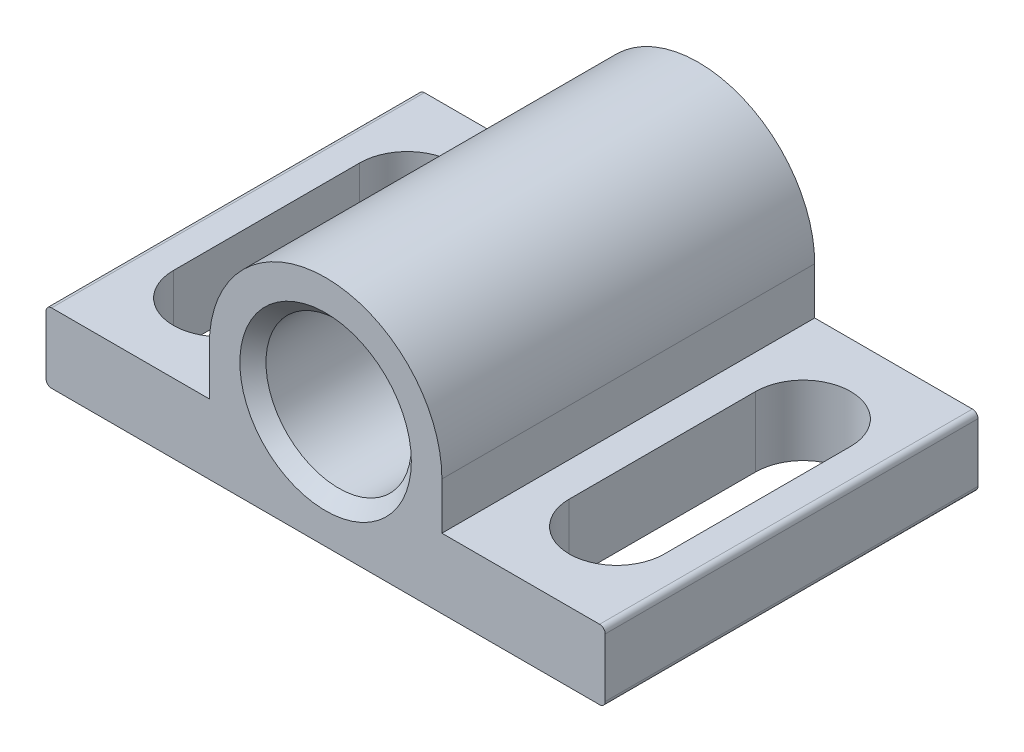
ISO-10303-21;
HEADER;
FILE_DESCRIPTION(('STEP AP214'),'2;1');
FILE_NAME('part.step','',(''),(''),'','','');
FILE_SCHEMA(('AUTOMOTIVE_DESIGN { 1 0 10303 214 1 1 1 1 }'));
ENDSEC;
DATA;
#1=APPLICATION_CONTEXT('core data for automotive mechanical design processes');
#2=APPLICATION_PROTOCOL_DEFINITION('international standard','automotive_design',2000,#1);
#3=PRODUCT_CONTEXT('',#1,'mechanical');
#4=PRODUCT('Part','Part','',(#3));
#5=PRODUCT_RELATED_PRODUCT_CATEGORY('part','',(#4));
#6=PRODUCT_DEFINITION_FORMATION('','',#4);
#7=PRODUCT_DEFINITION_CONTEXT('part definition',#1,'design');
#8=PRODUCT_DEFINITION('design','',#6,#7);
#9=PRODUCT_DEFINITION_SHAPE('','',#8);
#10=(LENGTH_UNIT() NAMED_UNIT(*) SI_UNIT(.MILLI.,.METRE.));
#11=(NAMED_UNIT(*) PLANE_ANGLE_UNIT() SI_UNIT($,.RADIAN.));
#12=(NAMED_UNIT(*) SI_UNIT($,.STERADIAN.) SOLID_ANGLE_UNIT());
#13=UNCERTAINTY_MEASURE_WITH_UNIT(LENGTH_MEASURE(1.E-05),#10,'distance_accuracy_value','');
#14=(GEOMETRIC_REPRESENTATION_CONTEXT(3) GLOBAL_UNCERTAINTY_ASSIGNED_CONTEXT((#13)) GLOBAL_UNIT_ASSIGNED_CONTEXT((#10,
#11,#12)) REPRESENTATION_CONTEXT('',''));
#15=CARTESIAN_POINT('',(0.,0.,0.));
#16=DIRECTION('',(0.,0.,1.));
#17=DIRECTION('',(1.,0.,0.));
#18=AXIS2_PLACEMENT_3D('',#15,#16,#17);
#19=CARTESIAN_POINT('',(0.,5.5753,12.7));
#20=DIRECTION('',(0.,0.,1.));
#21=DIRECTION('',(1.,0.,0.));
#22=AXIS2_PLACEMENT_3D('',#19,#20,#21);
#23=PLANE('',#22);
#24=CARTESIAN_POINT('',(0.,5.5753,12.7));
#25=DIRECTION('',(0.,0.,1.));
#26=DIRECTION('',(1.,0.,0.));
#27=AXIS2_PLACEMENT_3D('',#24,#25,#26);
#28=CIRCLE('',#27,5.84200000000002);
#29=CARTESIAN_POINT('',(5.84200000000002,5.5753,12.7));
#30=VERTEX_POINT('',#29);
#31=EDGE_CURVE('E321',#30,#30,#28,.F.);
#32=ORIENTED_EDGE('',*,*,#31,.T.);
#33=EDGE_LOOP('',(#32));
#34=FACE_BOUND('',#33,.T.);
#35=DIRECTION('',(0.,1.,0.));
#36=VECTOR('',#35,1.);
#37=CARTESIAN_POINT('',(19.05,-2.3749,12.7));
#38=LINE('',#37,#36);
#39=CARTESIAN_POINT('',(19.05,-1.9939,12.7));
#40=VERTEX_POINT('',#39);
#41=CARTESIAN_POINT('',(19.05,1.9939,12.7));
#42=VERTEX_POINT('',#41);
#43=EDGE_CURVE('E247',#40,#42,#38,.T.);
#44=ORIENTED_EDGE('',*,*,#43,.T.);
#45=CARTESIAN_POINT('',(18.669,1.9939,12.7));
#46=DIRECTION('',(0.,0.,1.));
#47=DIRECTION('',(1.,0.,0.));
#48=AXIS2_PLACEMENT_3D('',#45,#46,#47);
#49=CIRCLE('',#48,0.381);
#50=CARTESIAN_POINT('',(18.669,2.3749,12.7));
#51=VERTEX_POINT('',#50);
#52=EDGE_CURVE('E302',#42,#51,#49,.T.);
#53=ORIENTED_EDGE('',*,*,#52,.T.);
#54=DIRECTION('',(-1.,0.,0.));
#55=VECTOR('',#54,1.);
#56=CARTESIAN_POINT('',(7.9248,2.3749,12.7));
#57=LINE('',#56,#55);
#58=CARTESIAN_POINT('',(7.9248,2.3749,12.7));
#59=VERTEX_POINT('',#58);
#60=EDGE_CURVE('E229',#51,#59,#57,.T.);
#61=ORIENTED_EDGE('',*,*,#60,.T.);
#62=DIRECTION('',(0.,1.,0.));
#63=VECTOR('',#62,1.);
#64=CARTESIAN_POINT('',(7.9248,5.5753,12.7));
#65=LINE('',#64,#63);
#66=CARTESIAN_POINT('',(7.9248,5.5753,12.7));
#67=VERTEX_POINT('',#66);
#68=EDGE_CURVE('E231',#59,#67,#65,.T.);
#69=ORIENTED_EDGE('',*,*,#68,.T.);
#70=CARTESIAN_POINT('',(0.,5.5753,12.7));
#71=DIRECTION('',(0.,0.,1.));
#72=DIRECTION('',(1.,0.,0.));
#73=AXIS2_PLACEMENT_3D('',#70,#71,#72);
#74=CIRCLE('',#73,7.9248);
#75=CARTESIAN_POINT('',(-7.9248,5.5753,12.7));
#76=VERTEX_POINT('',#75);
#77=EDGE_CURVE('E234',#67,#76,#74,.T.);
#78=ORIENTED_EDGE('',*,*,#77,.T.);
#79=DIRECTION('',(0.,-1.,0.));
#80=VECTOR('',#79,1.);
#81=CARTESIAN_POINT('',(-7.9248,5.5753,12.7));
#82=LINE('',#81,#80);
#83=CARTESIAN_POINT('',(-7.9248,2.3749,12.7));
#84=VERTEX_POINT('',#83);
#85=EDGE_CURVE('E236',#76,#84,#82,.T.);
#86=ORIENTED_EDGE('',*,*,#85,.T.);
#87=DIRECTION('',(-1.,0.,0.));
#88=VECTOR('',#87,1.);
#89=CARTESIAN_POINT('',(-19.05,2.3749,12.7));
#90=LINE('',#89,#88);
#91=CARTESIAN_POINT('',(-18.669,2.3749,12.7));
#92=VERTEX_POINT('',#91);
#93=EDGE_CURVE('E238',#84,#92,#90,.T.);
#94=ORIENTED_EDGE('',*,*,#93,.T.);
#95=CARTESIAN_POINT('',(-18.669,1.9939,12.7));
#96=DIRECTION('',(0.,0.,1.));
#97=DIRECTION('',(1.,0.,0.));
#98=AXIS2_PLACEMENT_3D('',#95,#96,#97);
#99=CIRCLE('',#98,0.381);
#100=CARTESIAN_POINT('',(-19.05,1.9939,12.7));
#101=VERTEX_POINT('',#100);
#102=EDGE_CURVE('E298',#92,#101,#99,.T.);
#103=ORIENTED_EDGE('',*,*,#102,.T.);
#104=DIRECTION('',(0.,-1.,0.));
#105=VECTOR('',#104,1.);
#106=CARTESIAN_POINT('',(-19.05,-2.3749,12.7));
#107=LINE('',#106,#105);
#108=CARTESIAN_POINT('',(-19.05,-1.9939,12.7));
#109=VERTEX_POINT('',#108);
#110=EDGE_CURVE('E241',#101,#109,#107,.T.);
#111=ORIENTED_EDGE('',*,*,#110,.T.);
#112=CARTESIAN_POINT('',(-18.669,-1.9939,12.7));
#113=DIRECTION('',(0.,0.,1.));
#114=DIRECTION('',(1.,0.,0.));
#115=AXIS2_PLACEMENT_3D('',#112,#113,#114);
#116=CIRCLE('',#115,0.381);
#117=CARTESIAN_POINT('',(-18.669,-2.3749,12.7));
#118=VERTEX_POINT('',#117);
#119=EDGE_CURVE('E300',#109,#118,#116,.T.);
#120=ORIENTED_EDGE('',*,*,#119,.T.);
#121=DIRECTION('',(1.,0.,0.));
#122=VECTOR('',#121,1.);
#123=CARTESIAN_POINT('',(-19.05,-2.3749,12.7));
#124=LINE('',#123,#122);
#125=CARTESIAN_POINT('',(18.669,-2.3749,12.7));
#126=VERTEX_POINT('',#125);
#127=EDGE_CURVE('E244',#118,#126,#124,.T.);
#128=ORIENTED_EDGE('',*,*,#127,.T.);
#129=CARTESIAN_POINT('',(18.669,-1.9939,12.7));
#130=DIRECTION('',(0.,0.,1.));
#131=DIRECTION('',(1.,0.,0.));
#132=AXIS2_PLACEMENT_3D('',#129,#130,#131);
#133=CIRCLE('',#132,0.381);
#134=EDGE_CURVE('E296',#126,#40,#133,.T.);
#135=ORIENTED_EDGE('',*,*,#134,.T.);
#136=EDGE_LOOP('',(#44,#53,#61,#69,#78,#86,#94,#103,#111,#120,#128,#135));
#137=FACE_BOUND('',#136,.T.);
#138=ADVANCED_FACE('F36',(#34,#137),#23,.T.);
#139=CARTESIAN_POINT('',(0.,5.5753,-12.7));
#140=DIRECTION('',(0.,0.,1.));
#141=DIRECTION('',(1.,0.,0.));
#142=AXIS2_PLACEMENT_3D('',#139,#140,#141);
#143=PLANE('',#142);
#144=DIRECTION('',(-1.,0.,0.));
#145=VECTOR('',#144,1.);
#146=CARTESIAN_POINT('',(7.9248,2.3749,-12.7));
#147=LINE('',#146,#145);
#148=CARTESIAN_POINT('',(18.669,2.3749,-12.7));
#149=VERTEX_POINT('',#148);
#150=CARTESIAN_POINT('',(7.9248,2.3749,-12.7));
#151=VERTEX_POINT('',#150);
#152=EDGE_CURVE('E228',#149,#151,#147,.T.);
#153=ORIENTED_EDGE('',*,*,#152,.F.);
#154=CARTESIAN_POINT('',(18.669,1.9939,-12.7));
#155=DIRECTION('',(0.,0.,1.));
#156=DIRECTION('',(1.,0.,0.));
#157=AXIS2_PLACEMENT_3D('',#154,#155,#156);
#158=CIRCLE('',#157,0.381);
#159=CARTESIAN_POINT('',(19.05,1.9939,-12.7));
#160=VERTEX_POINT('',#159);
#161=EDGE_CURVE('E289',#149,#160,#158,.F.);
#162=ORIENTED_EDGE('',*,*,#161,.T.);
#163=DIRECTION('',(0.,1.,0.));
#164=VECTOR('',#163,1.);
#165=CARTESIAN_POINT('',(19.05,-2.3749,-12.7));
#166=LINE('',#165,#164);
#167=CARTESIAN_POINT('',(19.05,-1.9939,-12.7));
#168=VERTEX_POINT('',#167);
#169=EDGE_CURVE('E232',#168,#160,#166,.T.);
#170=ORIENTED_EDGE('',*,*,#169,.F.);
#171=CARTESIAN_POINT('',(18.669,-1.9939,-12.7));
#172=DIRECTION('',(0.,0.,1.));
#173=DIRECTION('',(1.,0.,0.));
#174=AXIS2_PLACEMENT_3D('',#171,#172,#173);
#175=CIRCLE('',#174,0.381);
#176=CARTESIAN_POINT('',(18.669,-2.3749,-12.7));
#177=VERTEX_POINT('',#176);
#178=EDGE_CURVE('E283',#168,#177,#175,.F.);
#179=ORIENTED_EDGE('',*,*,#178,.T.);
#180=DIRECTION('',(1.,0.,0.));
#181=VECTOR('',#180,1.);
#182=CARTESIAN_POINT('',(-19.05,-2.3749,-12.7));
#183=LINE('',#182,#181);
#184=CARTESIAN_POINT('',(-18.669,-2.3749,-12.7));
#185=VERTEX_POINT('',#184);
#186=EDGE_CURVE('E264',#185,#177,#183,.T.);
#187=ORIENTED_EDGE('',*,*,#186,.F.);
#188=CARTESIAN_POINT('',(-18.669,-1.9939,-12.7));
#189=DIRECTION('',(0.,0.,1.));
#190=DIRECTION('',(1.,0.,0.));
#191=AXIS2_PLACEMENT_3D('',#188,#189,#190);
#192=CIRCLE('',#191,0.381);
#193=CARTESIAN_POINT('',(-19.05,-1.9939,-12.7));
#194=VERTEX_POINT('',#193);
#195=EDGE_CURVE('E287',#185,#194,#192,.F.);
#196=ORIENTED_EDGE('',*,*,#195,.T.);
#197=DIRECTION('',(0.,-1.,0.));
#198=VECTOR('',#197,1.);
#199=CARTESIAN_POINT('',(-19.05,-2.3749,-12.7));
#200=LINE('',#199,#198);
#201=CARTESIAN_POINT('',(-19.05,1.9939,-12.7));
#202=VERTEX_POINT('',#201);
#203=EDGE_CURVE('E261',#202,#194,#200,.T.);
#204=ORIENTED_EDGE('',*,*,#203,.F.);
#205=CARTESIAN_POINT('',(-18.669,1.9939,-12.7));
#206=DIRECTION('',(0.,0.,1.));
#207=DIRECTION('',(1.,0.,0.));
#208=AXIS2_PLACEMENT_3D('',#205,#206,#207);
#209=CIRCLE('',#208,0.381);
#210=CARTESIAN_POINT('',(-18.669,2.3749,-12.7));
#211=VERTEX_POINT('',#210);
#212=EDGE_CURVE('E285',#202,#211,#209,.F.);
#213=ORIENTED_EDGE('',*,*,#212,.T.);
#214=DIRECTION('',(-1.,0.,0.));
#215=VECTOR('',#214,1.);
#216=CARTESIAN_POINT('',(-19.05,2.3749,-12.7));
#217=LINE('',#216,#215);
#218=CARTESIAN_POINT('',(-7.9248,2.3749,-12.7));
#219=VERTEX_POINT('',#218);
#220=EDGE_CURVE('E258',#219,#211,#217,.T.);
#221=ORIENTED_EDGE('',*,*,#220,.F.);
#222=DIRECTION('',(0.,-1.,0.));
#223=VECTOR('',#222,1.);
#224=CARTESIAN_POINT('',(-7.9248,5.5753,-12.7));
#225=LINE('',#224,#223);
#226=CARTESIAN_POINT('',(-7.9248,5.5753,-12.7));
#227=VERTEX_POINT('',#226);
#228=EDGE_CURVE('E256',#227,#219,#225,.T.);
#229=ORIENTED_EDGE('',*,*,#228,.F.);
#230=CARTESIAN_POINT('',(0.,5.5753,-12.7));
#231=DIRECTION('',(0.,0.,1.));
#232=DIRECTION('',(1.,0.,0.));
#233=AXIS2_PLACEMENT_3D('',#230,#231,#232);
#234=CIRCLE('',#233,7.9248);
#235=CARTESIAN_POINT('',(7.9248,5.5753,-12.7));
#236=VERTEX_POINT('',#235);
#237=EDGE_CURVE('E254',#236,#227,#234,.T.);
#238=ORIENTED_EDGE('',*,*,#237,.F.);
#239=DIRECTION('',(0.,1.,0.));
#240=VECTOR('',#239,1.);
#241=CARTESIAN_POINT('',(7.9248,5.5753,-12.7));
#242=LINE('',#241,#240);
#243=EDGE_CURVE('E252',#151,#236,#242,.T.);
#244=ORIENTED_EDGE('',*,*,#243,.F.);
#245=EDGE_LOOP('',(#153,#162,#170,#179,#187,#196,#204,#213,#221,#229,#238,#244));
#246=FACE_BOUND('',#245,.T.);
#247=CARTESIAN_POINT('',(0.,5.5753,-12.7));
#248=DIRECTION('',(0.,0.,1.));
#249=DIRECTION('',(1.,0.,0.));
#250=AXIS2_PLACEMENT_3D('',#247,#248,#249);
#251=CIRCLE('',#250,2.5527);
#252=CARTESIAN_POINT('',(2.5527,5.5753,-12.7));
#253=VERTEX_POINT('',#252);
#254=EDGE_CURVE('E225',#253,#253,#251,.T.);
#255=ORIENTED_EDGE('',*,*,#254,.T.);
#256=EDGE_LOOP('',(#255));
#257=FACE_BOUND('',#256,.T.);
#258=ADVANCED_FACE('F360',(#246,#257),#143,.F.);
#259=CARTESIAN_POINT('',(7.9248,2.3749,12.7));
#260=DIRECTION('',(0.,-1.,0.));
#261=DIRECTION('',(1.,0.,0.));
#262=AXIS2_PLACEMENT_3D('',#259,#260,#261);
#263=PLANE('',#262);
#264=DIRECTION('',(0.,0.,1.));
#265=VECTOR('',#264,1.);
#266=CARTESIAN_POINT('',(10.2489,2.3749,-6.34999999999999));
#267=LINE('',#266,#265);
#268=CARTESIAN_POINT('',(10.2489,2.3749,-6.34999999999999));
#269=VERTEX_POINT('',#268);
#270=CARTESIAN_POINT('',(10.2489,2.3749,6.34999999999999));
#271=VERTEX_POINT('',#270);
#272=EDGE_CURVE('E203',#269,#271,#267,.T.);
#273=ORIENTED_EDGE('',*,*,#272,.F.);
#274=CARTESIAN_POINT('',(13.4874,2.3749,-6.35));
#275=DIRECTION('',(0.,1.,0.));
#276=DIRECTION('',(-1.,0.,0.));
#277=AXIS2_PLACEMENT_3D('',#274,#275,#276);
#278=CIRCLE('',#277,3.2385);
#279=CARTESIAN_POINT('',(16.7259,2.3749,-6.35));
#280=VERTEX_POINT('',#279);
#281=EDGE_CURVE('E199',#280,#269,#278,.T.);
#282=ORIENTED_EDGE('',*,*,#281,.F.);
#283=DIRECTION('',(0.,0.,-1.));
#284=VECTOR('',#283,1.);
#285=CARTESIAN_POINT('',(16.7259,2.3749,-6.35));
#286=LINE('',#285,#284);
#287=CARTESIAN_POINT('',(16.7259,2.3749,6.35));
#288=VERTEX_POINT('',#287);
#289=EDGE_CURVE('E209',#288,#280,#286,.T.);
#290=ORIENTED_EDGE('',*,*,#289,.F.);
#291=CARTESIAN_POINT('',(13.4874,2.3749,6.35));
#292=DIRECTION('',(0.,1.,0.));
#293=DIRECTION('',(-1.,0.,0.));
#294=AXIS2_PLACEMENT_3D('',#291,#292,#293);
#295=CIRCLE('',#294,3.2385);
#296=EDGE_CURVE('E206',#271,#288,#295,.T.);
#297=ORIENTED_EDGE('',*,*,#296,.F.);
#298=EDGE_LOOP('',(#273,#282,#290,#297));
#299=FACE_BOUND('',#298,.T.);
#300=ORIENTED_EDGE('',*,*,#60,.F.);
#301=DIRECTION('',(0.,0.,-1.));
#302=VECTOR('',#301,1.);
#303=CARTESIAN_POINT('',(18.669,2.3749,12.7));
#304=LINE('',#303,#302);
#305=EDGE_CURVE('E280',#51,#149,#304,.T.);
#306=ORIENTED_EDGE('',*,*,#305,.T.);
#307=ORIENTED_EDGE('',*,*,#152,.T.);
#308=DIRECTION('',(0.,0.,-1.));
#309=VECTOR('',#308,1.);
#310=CARTESIAN_POINT('',(7.9248,2.3749,12.7));
#311=LINE('',#310,#309);
#312=EDGE_CURVE('E277',#59,#151,#311,.T.);
#313=ORIENTED_EDGE('',*,*,#312,.F.);
#314=EDGE_LOOP('',(#300,#306,#307,#313));
#315=FACE_BOUND('',#314,.T.);
#316=ADVANCED_FACE('F366',(#299,#315),#263,.F.);
#317=CARTESIAN_POINT('',(7.9248,5.5753,12.7));
#318=DIRECTION('',(-1.,0.,0.));
#319=DIRECTION('',(0.,-1.,0.));
#320=AXIS2_PLACEMENT_3D('',#317,#318,#319);
#321=PLANE('',#320);
#322=ORIENTED_EDGE('',*,*,#243,.T.);
#323=DIRECTION('',(0.,0.,-1.));
#324=VECTOR('',#323,1.);
#325=CARTESIAN_POINT('',(7.9248,5.5753,12.7));
#326=LINE('',#325,#324);
#327=EDGE_CURVE('E274',#67,#236,#326,.T.);
#328=ORIENTED_EDGE('',*,*,#327,.F.);
#329=ORIENTED_EDGE('',*,*,#68,.F.);
#330=ORIENTED_EDGE('',*,*,#312,.T.);
#331=EDGE_LOOP('',(#322,#328,#329,#330));
#332=FACE_BOUND('',#331,.T.);
#333=ADVANCED_FACE('F393',(#332),#321,.F.);
#334=CARTESIAN_POINT('',(0.,5.5753,12.7));
#335=DIRECTION('',(0.,0.,-1.));
#336=DIRECTION('',(-1.,0.,0.));
#337=AXIS2_PLACEMENT_3D('',#334,#335,#336);
#338=CYLINDRICAL_SURFACE('',#337,7.9248);
#339=ORIENTED_EDGE('',*,*,#237,.T.);
#340=DIRECTION('',(0.,0.,-1.));
#341=VECTOR('',#340,1.);
#342=CARTESIAN_POINT('',(-7.9248,5.5753,12.7));
#343=LINE('',#342,#341);
#344=EDGE_CURVE('E271',#76,#227,#343,.T.);
#345=ORIENTED_EDGE('',*,*,#344,.F.);
#346=ORIENTED_EDGE('',*,*,#77,.F.);
#347=ORIENTED_EDGE('',*,*,#327,.T.);
#348=EDGE_LOOP('',(#339,#345,#346,#347));
#349=FACE_BOUND('',#348,.T.);
#350=ADVANCED_FACE('F389',(#349),#338,.T.);
#351=CARTESIAN_POINT('',(-7.9248,5.5753,12.7));
#352=DIRECTION('',(1.,0.,0.));
#353=DIRECTION('',(0.,1.,0.));
#354=AXIS2_PLACEMENT_3D('',#351,#352,#353);
#355=PLANE('',#354);
#356=ORIENTED_EDGE('',*,*,#228,.T.);
#357=DIRECTION('',(0.,0.,-1.));
#358=VECTOR('',#357,1.);
#359=CARTESIAN_POINT('',(-7.9248,2.3749,12.7));
#360=LINE('',#359,#358);
#361=EDGE_CURVE('E250',#84,#219,#360,.T.);
#362=ORIENTED_EDGE('',*,*,#361,.F.);
#363=ORIENTED_EDGE('',*,*,#85,.F.);
#364=ORIENTED_EDGE('',*,*,#344,.T.);
#365=EDGE_LOOP('',(#356,#362,#363,#364));
#366=FACE_BOUND('',#365,.T.);
#367=ADVANCED_FACE('F386',(#366),#355,.F.);
#368=CARTESIAN_POINT('',(-19.05,2.3749,12.7));
#369=DIRECTION('',(0.,-1.,0.));
#370=DIRECTION('',(1.,0.,0.));
#371=AXIS2_PLACEMENT_3D('',#368,#369,#370);
#372=PLANE('',#371);
#373=DIRECTION('',(0.,0.,1.));
#374=VECTOR('',#373,1.);
#375=CARTESIAN_POINT('',(-16.7259,2.3749,-6.35));
#376=LINE('',#375,#374);
#377=CARTESIAN_POINT('',(-16.7259,2.3749,-6.34999999999999));
#378=VERTEX_POINT('',#377);
#379=CARTESIAN_POINT('',(-16.7259,2.3749,6.35));
#380=VERTEX_POINT('',#379);
#381=EDGE_CURVE('E185',#378,#380,#376,.T.);
#382=ORIENTED_EDGE('',*,*,#381,.F.);
#383=CARTESIAN_POINT('',(-13.4874,2.3749,-6.35));
#384=DIRECTION('',(0.,1.,0.));
#385=DIRECTION('',(1.,0.,0.));
#386=AXIS2_PLACEMENT_3D('',#383,#384,#385);
#387=CIRCLE('',#386,3.2385);
#388=CARTESIAN_POINT('',(-10.2489,2.3749,-6.34999999999999));
#389=VERTEX_POINT('',#388);
#390=EDGE_CURVE('E51',#389,#378,#387,.T.);
#391=ORIENTED_EDGE('',*,*,#390,.F.);
#392=DIRECTION('',(0.,0.,-1.));
#393=VECTOR('',#392,1.);
#394=CARTESIAN_POINT('',(-10.2489,2.3749,-6.34999999999999));
#395=LINE('',#394,#393);
#396=CARTESIAN_POINT('',(-10.2489,2.3749,6.34999999999999));
#397=VERTEX_POINT('',#396);
#398=EDGE_CURVE('E192',#397,#389,#395,.T.);
#399=ORIENTED_EDGE('',*,*,#398,.F.);
#400=CARTESIAN_POINT('',(-13.4874,2.3749,6.35));
#401=DIRECTION('',(0.,1.,0.));
#402=DIRECTION('',(1.,0.,0.));
#403=AXIS2_PLACEMENT_3D('',#400,#401,#402);
#404=CIRCLE('',#403,3.2385);
#405=EDGE_CURVE('E176',#380,#397,#404,.T.);
#406=ORIENTED_EDGE('',*,*,#405,.F.);
#407=EDGE_LOOP('',(#382,#391,#399,#406));
#408=FACE_BOUND('',#407,.T.);
#409=ORIENTED_EDGE('',*,*,#220,.T.);
#410=DIRECTION('',(0.,0.,-1.));
#411=VECTOR('',#410,1.);
#412=CARTESIAN_POINT('',(-18.669,2.3749,12.7));
#413=LINE('',#412,#411);
#414=EDGE_CURVE('E314',#211,#92,#413,.F.);
#415=ORIENTED_EDGE('',*,*,#414,.T.);
#416=ORIENTED_EDGE('',*,*,#93,.F.);
#417=ORIENTED_EDGE('',*,*,#361,.T.);
#418=EDGE_LOOP('',(#409,#415,#416,#417));
#419=FACE_BOUND('',#418,.T.);
#420=ADVANCED_FACE('F189',(#408,#419),#372,.F.);
#421=CARTESIAN_POINT('',(-19.05,-2.3749,12.7));
#422=DIRECTION('',(1.,0.,0.));
#423=DIRECTION('',(0.,0.,-1.));
#424=AXIS2_PLACEMENT_3D('',#421,#422,#423);
#425=PLANE('',#424);
#426=ORIENTED_EDGE('',*,*,#203,.T.);
#427=DIRECTION('',(0.,0.,-1.));
#428=VECTOR('',#427,1.);
#429=CARTESIAN_POINT('',(-19.05,-1.9939,12.7));
#430=LINE('',#429,#428);
#431=EDGE_CURVE('E312',#194,#109,#430,.F.);
#432=ORIENTED_EDGE('',*,*,#431,.T.);
#433=ORIENTED_EDGE('',*,*,#110,.F.);
#434=DIRECTION('',(0.,0.,-1.));
#435=VECTOR('',#434,1.);
#436=CARTESIAN_POINT('',(-19.05,1.9939,12.7));
#437=LINE('',#436,#435);
#438=EDGE_CURVE('E309',#101,#202,#437,.T.);
#439=ORIENTED_EDGE('',*,*,#438,.T.);
#440=EDGE_LOOP('',(#426,#432,#433,#439));
#441=FACE_BOUND('',#440,.T.);
#442=ADVANCED_FACE('F380',(#441),#425,.F.);
#443=CARTESIAN_POINT('',(-19.05,-2.3749,12.7));
#444=DIRECTION('',(0.,1.,0.));
#445=DIRECTION('',(0.,0.,1.));
#446=AXIS2_PLACEMENT_3D('',#443,#444,#445);
#447=PLANE('',#446);
#448=DIRECTION('',(0.,0.,-1.));
#449=VECTOR('',#448,1.);
#450=CARTESIAN_POINT('',(-10.2489,-2.3749,12.7));
#451=LINE('',#450,#449);
#452=CARTESIAN_POINT('',(-10.2489,-2.3749,6.34999999999999));
#453=VERTEX_POINT('',#452);
#454=CARTESIAN_POINT('',(-10.2489,-2.3749,-6.34999999999999));
#455=VERTEX_POINT('',#454);
#456=EDGE_CURVE('E44',#453,#455,#451,.T.);
#457=ORIENTED_EDGE('',*,*,#456,.T.);
#458=CARTESIAN_POINT('',(-13.4874,-2.3749,-6.35));
#459=DIRECTION('',(0.,1.,0.));
#460=DIRECTION('',(0.,0.,1.));
#461=AXIS2_PLACEMENT_3D('',#458,#459,#460);
#462=CIRCLE('',#461,3.2385);
#463=CARTESIAN_POINT('',(-16.7259,-2.3749,-6.35));
#464=VERTEX_POINT('',#463);
#465=EDGE_CURVE('E11',#455,#464,#462,.T.);
#466=ORIENTED_EDGE('',*,*,#465,.T.);
#467=DIRECTION('',(0.,0.,1.));
#468=VECTOR('',#467,1.);
#469=CARTESIAN_POINT('',(-16.7259,-2.3749,12.7));
#470=LINE('',#469,#468);
#471=CARTESIAN_POINT('',(-16.7259,-2.3749,6.35));
#472=VERTEX_POINT('',#471);
#473=EDGE_CURVE('E336',#464,#472,#470,.T.);
#474=ORIENTED_EDGE('',*,*,#473,.T.);
#475=CARTESIAN_POINT('',(-13.4874,-2.3749,6.35));
#476=DIRECTION('',(0.,1.,0.));
#477=DIRECTION('',(0.,0.,1.));
#478=AXIS2_PLACEMENT_3D('',#475,#476,#477);
#479=CIRCLE('',#478,3.2385);
#480=EDGE_CURVE('E179',#472,#453,#479,.T.);
#481=ORIENTED_EDGE('',*,*,#480,.T.);
#482=EDGE_LOOP('',(#457,#466,#474,#481));
#483=FACE_BOUND('',#482,.T.);
#484=DIRECTION('',(0.,0.,-1.));
#485=VECTOR('',#484,1.);
#486=CARTESIAN_POINT('',(16.7259,-2.3749,12.7));
#487=LINE('',#486,#485);
#488=CARTESIAN_POINT('',(16.7259,-2.3749,6.35));
#489=VERTEX_POINT('',#488);
#490=CARTESIAN_POINT('',(16.7259,-2.3749,-6.35));
#491=VERTEX_POINT('',#490);
#492=EDGE_CURVE('E330',#489,#491,#487,.T.);
#493=ORIENTED_EDGE('',*,*,#492,.T.);
#494=CARTESIAN_POINT('',(13.4874,-2.3749,-6.35));
#495=DIRECTION('',(0.,1.,0.));
#496=DIRECTION('',(0.,0.,1.));
#497=AXIS2_PLACEMENT_3D('',#494,#495,#496);
#498=CIRCLE('',#497,3.2385);
#499=CARTESIAN_POINT('',(10.2489,-2.3749,-6.34999999999999));
#500=VERTEX_POINT('',#499);
#501=EDGE_CURVE('E333',#491,#500,#498,.T.);
#502=ORIENTED_EDGE('',*,*,#501,.T.);
#503=DIRECTION('',(0.,0.,1.));
#504=VECTOR('',#503,1.);
#505=CARTESIAN_POINT('',(10.2489,-2.3749,12.7));
#506=LINE('',#505,#504);
#507=CARTESIAN_POINT('',(10.2489,-2.3749,6.34999999999999));
#508=VERTEX_POINT('',#507);
#509=EDGE_CURVE('E324',#500,#508,#506,.T.);
#510=ORIENTED_EDGE('',*,*,#509,.T.);
#511=CARTESIAN_POINT('',(13.4874,-2.3749,6.35));
#512=DIRECTION('',(0.,1.,0.));
#513=DIRECTION('',(0.,0.,1.));
#514=AXIS2_PLACEMENT_3D('',#511,#512,#513);
#515=CIRCLE('',#514,3.2385);
#516=EDGE_CURVE('E327',#508,#489,#515,.T.);
#517=ORIENTED_EDGE('',*,*,#516,.T.);
#518=EDGE_LOOP('',(#493,#502,#510,#517));
#519=FACE_BOUND('',#518,.T.);
#520=ORIENTED_EDGE('',*,*,#127,.F.);
#521=DIRECTION('',(0.,0.,-1.));
#522=VECTOR('',#521,1.);
#523=CARTESIAN_POINT('',(-18.669,-2.3749,12.7));
#524=LINE('',#523,#522);
#525=EDGE_CURVE('E306',#118,#185,#524,.T.);
#526=ORIENTED_EDGE('',*,*,#525,.T.);
#527=ORIENTED_EDGE('',*,*,#186,.T.);
#528=DIRECTION('',(0.,0.,-1.));
#529=VECTOR('',#528,1.);
#530=CARTESIAN_POINT('',(18.669,-2.3749,12.7));
#531=LINE('',#530,#529);
#532=EDGE_CURVE('E304',#177,#126,#531,.F.);
#533=ORIENTED_EDGE('',*,*,#532,.T.);
#534=EDGE_LOOP('',(#520,#526,#527,#533));
#535=FACE_BOUND('',#534,.T.);
#536=ADVANCED_FACE('F340',(#483,#519,#535),#447,.F.);
#537=CARTESIAN_POINT('',(19.05,-2.3749,12.7));
#538=DIRECTION('',(-1.,0.,0.));
#539=DIRECTION('',(0.,0.,1.));
#540=AXIS2_PLACEMENT_3D('',#537,#538,#539);
#541=PLANE('',#540);
#542=ORIENTED_EDGE('',*,*,#169,.T.);
#543=DIRECTION('',(0.,0.,-1.));
#544=VECTOR('',#543,1.);
#545=CARTESIAN_POINT('',(19.05,1.9939,12.7));
#546=LINE('',#545,#544);
#547=EDGE_CURVE('E294',#160,#42,#546,.F.);
#548=ORIENTED_EDGE('',*,*,#547,.T.);
#549=ORIENTED_EDGE('',*,*,#43,.F.);
#550=DIRECTION('',(0.,0.,-1.));
#551=VECTOR('',#550,1.);
#552=CARTESIAN_POINT('',(19.05,-1.9939,12.7));
#553=LINE('',#552,#551);
#554=EDGE_CURVE('E291',#40,#168,#553,.T.);
#555=ORIENTED_EDGE('',*,*,#554,.T.);
#556=EDGE_LOOP('',(#542,#548,#549,#555));
#557=FACE_BOUND('',#556,.T.);
#558=ADVANCED_FACE('F374',(#557),#541,.F.);
#559=CARTESIAN_POINT('',(0.,5.5753,12.7));
#560=DIRECTION('',(0.,0.,-1.));
#561=DIRECTION('',(-1.,0.,0.));
#562=AXIS2_PLACEMENT_3D('',#559,#560,#561);
#563=CYLINDRICAL_SURFACE('',#562,2.5527);
#564=CARTESIAN_POINT('',(0.,5.5753,-9.11122928785259));
#565=DIRECTION('',(0.,0.,1.));
#566=DIRECTION('',(1.,0.,0.));
#567=AXIS2_PLACEMENT_3D('',#564,#565,#566);
#568=CIRCLE('',#567,2.5527);
#569=CARTESIAN_POINT('',(2.5527,5.5753,-9.11122928785259));
#570=VERTEX_POINT('',#569);
#571=EDGE_CURVE('E224',#570,#570,#568,.F.);
#572=ORIENTED_EDGE('',*,*,#571,.F.);
#573=EDGE_LOOP('',(#572));
#574=FACE_BOUND('',#573,.T.);
#575=ORIENTED_EDGE('',*,*,#254,.F.);
#576=EDGE_LOOP('',(#575));
#577=FACE_BOUND('',#576,.T.);
#578=ADVANCED_FACE('F371',(#574,#577),#563,.F.);
#579=CARTESIAN_POINT('',(18.669,1.9939,12.7));
#580=DIRECTION('',(0.,0.,-1.));
#581=DIRECTION('',(-1.,0.,0.));
#582=AXIS2_PLACEMENT_3D('',#579,#580,#581);
#583=CYLINDRICAL_SURFACE('',#582,0.381);
#584=ORIENTED_EDGE('',*,*,#52,.F.);
#585=ORIENTED_EDGE('',*,*,#547,.F.);
#586=ORIENTED_EDGE('',*,*,#161,.F.);
#587=ORIENTED_EDGE('',*,*,#305,.F.);
#588=EDGE_LOOP('',(#584,#585,#586,#587));
#589=FACE_BOUND('',#588,.T.);
#590=ADVANCED_FACE('F401',(#589),#583,.T.);
#591=CARTESIAN_POINT('',(-18.669,-1.9939,12.7));
#592=DIRECTION('',(0.,0.,-1.));
#593=DIRECTION('',(-1.,0.,0.));
#594=AXIS2_PLACEMENT_3D('',#591,#592,#593);
#595=CYLINDRICAL_SURFACE('',#594,0.381);
#596=ORIENTED_EDGE('',*,*,#119,.F.);
#597=ORIENTED_EDGE('',*,*,#431,.F.);
#598=ORIENTED_EDGE('',*,*,#195,.F.);
#599=ORIENTED_EDGE('',*,*,#525,.F.);
#600=EDGE_LOOP('',(#596,#597,#598,#599));
#601=FACE_BOUND('',#600,.T.);
#602=ADVANCED_FACE('F404',(#601),#595,.T.);
#603=CARTESIAN_POINT('',(-18.669,1.9939,12.7));
#604=DIRECTION('',(0.,0.,-1.));
#605=DIRECTION('',(-1.,0.,0.));
#606=AXIS2_PLACEMENT_3D('',#603,#604,#605);
#607=CYLINDRICAL_SURFACE('',#606,0.381);
#608=ORIENTED_EDGE('',*,*,#102,.F.);
#609=ORIENTED_EDGE('',*,*,#414,.F.);
#610=ORIENTED_EDGE('',*,*,#212,.F.);
#611=ORIENTED_EDGE('',*,*,#438,.F.);
#612=EDGE_LOOP('',(#608,#609,#610,#611));
#613=FACE_BOUND('',#612,.T.);
#614=ADVANCED_FACE('F408',(#613),#607,.T.);
#615=CARTESIAN_POINT('',(18.669,-1.9939,12.7));
#616=DIRECTION('',(0.,0.,-1.));
#617=DIRECTION('',(-1.,0.,0.));
#618=AXIS2_PLACEMENT_3D('',#615,#616,#617);
#619=CYLINDRICAL_SURFACE('',#618,0.381);
#620=ORIENTED_EDGE('',*,*,#134,.F.);
#621=ORIENTED_EDGE('',*,*,#532,.F.);
#622=ORIENTED_EDGE('',*,*,#178,.F.);
#623=ORIENTED_EDGE('',*,*,#554,.F.);
#624=EDGE_LOOP('',(#620,#621,#622,#623));
#625=FACE_BOUND('',#624,.T.);
#626=ADVANCED_FACE('F411',(#625),#619,.T.);
#627=CARTESIAN_POINT('',(0.,5.5753,-6.35));
#628=DIRECTION('',(0.,0.,1.));
#629=DIRECTION('',(1.,0.,0.));
#630=AXIS2_PLACEMENT_3D('',#627,#628,#629);
#631=CONICAL_SURFACE('',#630,4.953,0.715584993317674);
#632=ORIENTED_EDGE('',*,*,#571,.T.);
#633=EDGE_LOOP('',(#632));
#634=FACE_BOUND('',#633,.T.);
#635=CARTESIAN_POINT('',(0.,5.5753,-6.35));
#636=DIRECTION('',(0.,0.,1.));
#637=DIRECTION('',(1.,0.,0.));
#638=AXIS2_PLACEMENT_3D('',#635,#636,#637);
#639=CIRCLE('',#638,4.953);
#640=CARTESIAN_POINT('',(4.953,5.5753,-6.35));
#641=VERTEX_POINT('',#640);
#642=EDGE_CURVE('E215',#641,#641,#639,.T.);
#643=ORIENTED_EDGE('',*,*,#642,.T.);
#644=EDGE_LOOP('',(#643));
#645=FACE_BOUND('',#644,.T.);
#646=ADVANCED_FACE('F414',(#634,#645),#631,.F.);
#647=CARTESIAN_POINT('',(0.,5.5753,12.7));
#648=DIRECTION('',(0.,0.,1.));
#649=DIRECTION('',(1.,0.,0.));
#650=AXIS2_PLACEMENT_3D('',#647,#648,#649);
#651=CYLINDRICAL_SURFACE('',#650,4.953);
#652=CARTESIAN_POINT('',(0.,5.5753,11.811));
#653=DIRECTION('',(0.,0.,1.));
#654=DIRECTION('',(1.,0.,0.));
#655=AXIS2_PLACEMENT_3D('',#652,#653,#654);
#656=CIRCLE('',#655,4.953);
#657=CARTESIAN_POINT('',(4.953,5.5753,11.811));
#658=VERTEX_POINT('',#657);
#659=EDGE_CURVE('E316',#658,#658,#656,.T.);
#660=ORIENTED_EDGE('',*,*,#659,.T.);
#661=EDGE_LOOP('',(#660));
#662=FACE_BOUND('',#661,.T.);
#663=ORIENTED_EDGE('',*,*,#642,.F.);
#664=EDGE_LOOP('',(#663));
#665=FACE_BOUND('',#664,.T.);
#666=ADVANCED_FACE('F419',(#662,#665),#651,.F.);
#667=CARTESIAN_POINT('',(0.,5.5753,11.811));
#668=DIRECTION('',(0.,0.,1.));
#669=DIRECTION('',(1.,0.,0.));
#670=AXIS2_PLACEMENT_3D('',#667,#668,#669);
#671=CONICAL_SURFACE('',#670,4.953,0.785398163397455);
#672=ORIENTED_EDGE('',*,*,#31,.F.);
#673=EDGE_LOOP('',(#672));
#674=FACE_BOUND('',#673,.T.);
#675=ORIENTED_EDGE('',*,*,#659,.F.);
#676=EDGE_LOOP('',(#675));
#677=FACE_BOUND('',#676,.T.);
#678=ADVANCED_FACE('F38',(#674,#677),#671,.F.);
#679=CARTESIAN_POINT('',(13.4874,-7.5311,-6.35));
#680=DIRECTION('',(0.,1.,0.));
#681=DIRECTION('',(-1.,0.,0.));
#682=AXIS2_PLACEMENT_3D('',#679,#680,#681);
#683=CYLINDRICAL_SURFACE('',#682,3.2385);
#684=DIRECTION('',(0.,1.,0.));
#685=VECTOR('',#684,1.);
#686=CARTESIAN_POINT('',(16.7259,-7.5311,-6.35));
#687=LINE('',#686,#685);
#688=EDGE_CURVE('E213',#491,#280,#687,.T.);
#689=ORIENTED_EDGE('',*,*,#688,.T.);
#690=ORIENTED_EDGE('',*,*,#281,.T.);
#691=DIRECTION('',(0.,1.,0.));
#692=VECTOR('',#691,1.);
#693=CARTESIAN_POINT('',(10.2489,-7.5311,-6.34999999999999));
#694=LINE('',#693,#692);
#695=EDGE_CURVE('E212',#500,#269,#694,.T.);
#696=ORIENTED_EDGE('',*,*,#695,.F.);
#697=ORIENTED_EDGE('',*,*,#501,.F.);
#698=EDGE_LOOP('',(#689,#690,#696,#697));
#699=FACE_BOUND('',#698,.T.);
#700=ADVANCED_FACE('F472',(#699),#683,.F.);
#701=CARTESIAN_POINT('',(16.7259,-7.5311,-6.35));
#702=DIRECTION('',(1.,0.,0.));
#703=DIRECTION('',(0.,1.,0.));
#704=AXIS2_PLACEMENT_3D('',#701,#702,#703);
#705=PLANE('',#704);
#706=DIRECTION('',(0.,1.,0.));
#707=VECTOR('',#706,1.);
#708=CARTESIAN_POINT('',(16.7259,-7.5311,6.35));
#709=LINE('',#708,#707);
#710=EDGE_CURVE('E216',#489,#288,#709,.T.);
#711=ORIENTED_EDGE('',*,*,#710,.T.);
#712=ORIENTED_EDGE('',*,*,#289,.T.);
#713=ORIENTED_EDGE('',*,*,#688,.F.);
#714=ORIENTED_EDGE('',*,*,#492,.F.);
#715=EDGE_LOOP('',(#711,#712,#713,#714));
#716=FACE_BOUND('',#715,.T.);
#717=ADVANCED_FACE('F476',(#716),#705,.F.);
#718=CARTESIAN_POINT('',(13.4874,-7.5311,6.35));
#719=DIRECTION('',(0.,1.,0.));
#720=DIRECTION('',(-1.,0.,0.));
#721=AXIS2_PLACEMENT_3D('',#718,#719,#720);
#722=CYLINDRICAL_SURFACE('',#721,3.2385);
#723=DIRECTION('',(0.,1.,0.));
#724=VECTOR('',#723,1.);
#725=CARTESIAN_POINT('',(10.2489,-7.5311,6.34999999999999));
#726=LINE('',#725,#724);
#727=EDGE_CURVE('E218',#508,#271,#726,.T.);
#728=ORIENTED_EDGE('',*,*,#727,.T.);
#729=ORIENTED_EDGE('',*,*,#296,.T.);
#730=ORIENTED_EDGE('',*,*,#710,.F.);
#731=ORIENTED_EDGE('',*,*,#516,.F.);
#732=EDGE_LOOP('',(#728,#729,#730,#731));
#733=FACE_BOUND('',#732,.T.);
#734=ADVANCED_FACE('F354',(#733),#722,.F.);
#735=CARTESIAN_POINT('',(10.2489,-7.5311,-6.34999999999999));
#736=DIRECTION('',(-1.,0.,0.));
#737=DIRECTION('',(0.,-1.,0.));
#738=AXIS2_PLACEMENT_3D('',#735,#736,#737);
#739=PLANE('',#738);
#740=ORIENTED_EDGE('',*,*,#695,.T.);
#741=ORIENTED_EDGE('',*,*,#272,.T.);
#742=ORIENTED_EDGE('',*,*,#727,.F.);
#743=ORIENTED_EDGE('',*,*,#509,.F.);
#744=EDGE_LOOP('',(#740,#741,#742,#743));
#745=FACE_BOUND('',#744,.T.);
#746=ADVANCED_FACE('F347',(#745),#739,.F.);
#747=CARTESIAN_POINT('',(-13.4874,-7.5311,-6.35));
#748=DIRECTION('',(0.,1.,0.));
#749=DIRECTION('',(-1.,0.,0.));
#750=AXIS2_PLACEMENT_3D('',#747,#748,#749);
#751=CYLINDRICAL_SURFACE('',#750,3.2385);
#752=DIRECTION('',(0.,1.,0.));
#753=VECTOR('',#752,1.);
#754=CARTESIAN_POINT('',(-10.2489,-7.5311,-6.34999999999999));
#755=LINE('',#754,#753);
#756=EDGE_CURVE('E197',#455,#389,#755,.T.);
#757=ORIENTED_EDGE('',*,*,#756,.T.);
#758=ORIENTED_EDGE('',*,*,#390,.T.);
#759=DIRECTION('',(0.,1.,0.));
#760=VECTOR('',#759,1.);
#761=CARTESIAN_POINT('',(-16.7259,-7.5311,-6.35));
#762=LINE('',#761,#760);
#763=EDGE_CURVE('E182',#464,#378,#762,.T.);
#764=ORIENTED_EDGE('',*,*,#763,.F.);
#765=ORIENTED_EDGE('',*,*,#465,.F.);
#766=EDGE_LOOP('',(#757,#758,#764,#765));
#767=FACE_BOUND('',#766,.T.);
#768=ADVANCED_FACE('F345',(#767),#751,.F.);
#769=CARTESIAN_POINT('',(-10.2489,-7.5311,-6.34999999999999));
#770=DIRECTION('',(1.,0.,0.));
#771=DIRECTION('',(0.,1.,0.));
#772=AXIS2_PLACEMENT_3D('',#769,#770,#771);
#773=PLANE('',#772);
#774=DIRECTION('',(0.,1.,0.));
#775=VECTOR('',#774,1.);
#776=CARTESIAN_POINT('',(-10.2489,-7.5311,6.34999999999999));
#777=LINE('',#776,#775);
#778=EDGE_CURVE('E181',#453,#397,#777,.T.);
#779=ORIENTED_EDGE('',*,*,#778,.T.);
#780=ORIENTED_EDGE('',*,*,#398,.T.);
#781=ORIENTED_EDGE('',*,*,#756,.F.);
#782=ORIENTED_EDGE('',*,*,#456,.F.);
#783=EDGE_LOOP('',(#779,#780,#781,#782));
#784=FACE_BOUND('',#783,.T.);
#785=ADVANCED_FACE('F344',(#784),#773,.F.);
#786=CARTESIAN_POINT('',(-13.4874,-7.5311,6.35));
#787=DIRECTION('',(0.,1.,0.));
#788=DIRECTION('',(-1.,0.,0.));
#789=AXIS2_PLACEMENT_3D('',#786,#787,#788);
#790=CYLINDRICAL_SURFACE('',#789,3.2385);
#791=DIRECTION('',(0.,1.,0.));
#792=VECTOR('',#791,1.);
#793=CARTESIAN_POINT('',(-16.7259,-7.5311,6.35));
#794=LINE('',#793,#792);
#795=EDGE_CURVE('E59',#472,#380,#794,.T.);
#796=ORIENTED_EDGE('',*,*,#795,.T.);
#797=ORIENTED_EDGE('',*,*,#405,.T.);
#798=ORIENTED_EDGE('',*,*,#778,.F.);
#799=ORIENTED_EDGE('',*,*,#480,.F.);
#800=EDGE_LOOP('',(#796,#797,#798,#799));
#801=FACE_BOUND('',#800,.T.);
#802=ADVANCED_FACE('F173',(#801),#790,.F.);
#803=CARTESIAN_POINT('',(-16.7259,-7.5311,-6.35));
#804=DIRECTION('',(-1.,0.,0.));
#805=DIRECTION('',(0.,-1.,0.));
#806=AXIS2_PLACEMENT_3D('',#803,#804,#805);
#807=PLANE('',#806);
#808=ORIENTED_EDGE('',*,*,#763,.T.);
#809=ORIENTED_EDGE('',*,*,#381,.T.);
#810=ORIENTED_EDGE('',*,*,#795,.F.);
#811=ORIENTED_EDGE('',*,*,#473,.F.);
#812=EDGE_LOOP('',(#808,#809,#810,#811));
#813=FACE_BOUND('',#812,.T.);
#814=ADVANCED_FACE('F186',(#813),#807,.F.);
#815=CLOSED_SHELL('',(#138,#258,#316,#333,#350,#367,#420,#442,#536,#558,#578,#590,#602,#614,
#626,#646,#666,#678,#700,#717,#734,#746,#768,#785,#802,#814));
#816=MANIFOLD_SOLID_BREP('B2',#815);
#817=ADVANCED_BREP_SHAPE_REPRESENTATION('',(#18,#816),#14);
#818=SHAPE_DEFINITION_REPRESENTATION(#9,#817);
ENDSEC;
END-ISO-10303-21;
